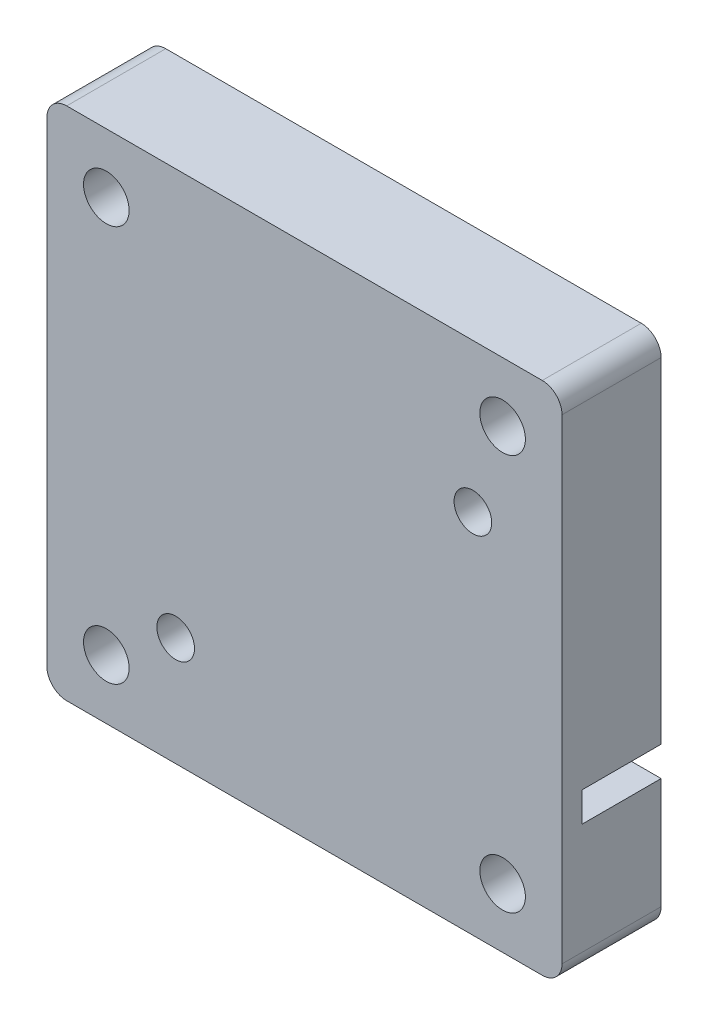
ISO-10303-21;
HEADER;
FILE_DESCRIPTION(('STEP AP214'),'2;1');
FILE_NAME('part.step','',(''),(''),'','','');
FILE_SCHEMA(('AUTOMOTIVE_DESIGN { 1 0 10303 214 1 1 1 1 }'));
ENDSEC;
DATA;
#1=APPLICATION_CONTEXT('core data for automotive mechanical design processes');
#2=APPLICATION_PROTOCOL_DEFINITION('international standard','automotive_design',2000,#1);
#3=PRODUCT_CONTEXT('',#1,'mechanical');
#4=PRODUCT('Part','Part','',(#3));
#5=PRODUCT_RELATED_PRODUCT_CATEGORY('part','',(#4));
#6=PRODUCT_DEFINITION_FORMATION('','',#4);
#7=PRODUCT_DEFINITION_CONTEXT('part definition',#1,'design');
#8=PRODUCT_DEFINITION('design','',#6,#7);
#9=PRODUCT_DEFINITION_SHAPE('','',#8);
#10=(LENGTH_UNIT() NAMED_UNIT(*) SI_UNIT(.MILLI.,.METRE.));
#11=(NAMED_UNIT(*) PLANE_ANGLE_UNIT() SI_UNIT($,.RADIAN.));
#12=(NAMED_UNIT(*) SI_UNIT($,.STERADIAN.) SOLID_ANGLE_UNIT());
#13=UNCERTAINTY_MEASURE_WITH_UNIT(LENGTH_MEASURE(1.E-05),#10,'distance_accuracy_value','');
#14=(GEOMETRIC_REPRESENTATION_CONTEXT(3) GLOBAL_UNCERTAINTY_ASSIGNED_CONTEXT((#13)) GLOBAL_UNIT_ASSIGNED_CONTEXT((#10,
#11,#12)) REPRESENTATION_CONTEXT('',''));
#15=CARTESIAN_POINT('',(0.,0.,0.));
#16=DIRECTION('',(0.,0.,1.));
#17=DIRECTION('',(1.,0.,0.));
#18=AXIS2_PLACEMENT_3D('',#15,#16,#17);
#19=CARTESIAN_POINT('',(6.6,-1.6,4.));
#20=DIRECTION('',(-1.,0.,0.));
#21=DIRECTION('',(0.,0.,1.));
#22=AXIS2_PLACEMENT_3D('',#19,#20,#21);
#23=PLANE('',#22);
#24=DIRECTION('',(0.,1.,0.));
#25=VECTOR('',#24,1.);
#26=CARTESIAN_POINT('',(6.6,-1.6,0.));
#27=LINE('',#26,#25);
#28=CARTESIAN_POINT('',(6.6,-2.4,0.));
#29=VERTEX_POINT('',#28);
#30=CARTESIAN_POINT('',(6.6,-1.6,0.));
#31=VERTEX_POINT('',#30);
#32=EDGE_CURVE('E268',#29,#31,#27,.T.);
#33=ORIENTED_EDGE('',*,*,#32,.F.);
#34=DIRECTION('',(0.,0.,1.));
#35=VECTOR('',#34,1.);
#36=CARTESIAN_POINT('',(6.6,-2.4,4.));
#37=LINE('',#36,#35);
#38=CARTESIAN_POINT('',(6.6,-2.4,4.));
#39=VERTEX_POINT('',#38);
#40=EDGE_CURVE('E316',#29,#39,#37,.T.);
#41=ORIENTED_EDGE('',*,*,#40,.T.);
#42=DIRECTION('',(0.,1.,0.));
#43=VECTOR('',#42,1.);
#44=CARTESIAN_POINT('',(6.6,-1.6,4.));
#45=LINE('',#44,#43);
#46=CARTESIAN_POINT('',(6.6,-1.6,4.));
#47=VERTEX_POINT('',#46);
#48=EDGE_CURVE('E255',#39,#47,#45,.T.);
#49=ORIENTED_EDGE('',*,*,#48,.T.);
#50=DIRECTION('',(0.,0.,-1.));
#51=VECTOR('',#50,1.);
#52=CARTESIAN_POINT('',(6.6,-1.6,4.));
#53=LINE('',#52,#51);
#54=EDGE_CURVE('E276',#47,#31,#53,.T.);
#55=ORIENTED_EDGE('',*,*,#54,.T.);
#56=EDGE_LOOP('',(#33,#41,#49,#55));
#57=FACE_BOUND('',#56,.T.);
#58=ADVANCED_FACE('F33',(#57),#23,.T.);
#59=CARTESIAN_POINT('',(-11.,11.,4.));
#60=DIRECTION('',(0.,0.,-1.));
#61=DIRECTION('',(-1.,0.,0.));
#62=AXIS2_PLACEMENT_3D('',#59,#60,#61);
#63=CYLINDRICAL_SURFACE('',#62,1.15);
#64=CARTESIAN_POINT('',(-11.,11.,5.));
#65=DIRECTION('',(0.,0.,1.));
#66=DIRECTION('',(1.,0.,0.));
#67=AXIS2_PLACEMENT_3D('',#64,#65,#66);
#68=CIRCLE('',#67,1.15);
#69=CARTESIAN_POINT('',(-9.85,11.,5.));
#70=VERTEX_POINT('',#69);
#71=EDGE_CURVE('E219',#70,#70,#68,.T.);
#72=ORIENTED_EDGE('',*,*,#71,.T.);
#73=EDGE_LOOP('',(#72));
#74=FACE_BOUND('',#73,.T.);
#75=CARTESIAN_POINT('',(-11.,11.,2.2));
#76=DIRECTION('',(0.,0.,-1.));
#77=DIRECTION('',(-1.,0.,0.));
#78=AXIS2_PLACEMENT_3D('',#75,#76,#77);
#79=CIRCLE('',#78,1.15);
#80=CARTESIAN_POINT('',(-12.15,11.,2.2));
#81=VERTEX_POINT('',#80);
#82=EDGE_CURVE('E218',#81,#81,#79,.T.);
#83=ORIENTED_EDGE('',*,*,#82,.T.);
#84=EDGE_LOOP('',(#83));
#85=FACE_BOUND('',#84,.T.);
#86=ADVANCED_FACE('F427',(#74,#85),#63,.F.);
#87=CARTESIAN_POINT('',(9.,-9.,4.));
#88=DIRECTION('',(0.,0.,-1.));
#89=DIRECTION('',(-1.,0.,0.));
#90=AXIS2_PLACEMENT_3D('',#87,#88,#89);
#91=CYLINDRICAL_SURFACE('',#90,1.15);
#92=CARTESIAN_POINT('',(9.,-9.,5.));
#93=DIRECTION('',(0.,0.,1.));
#94=DIRECTION('',(1.,0.,0.));
#95=AXIS2_PLACEMENT_3D('',#92,#93,#94);
#96=CIRCLE('',#95,1.15);
#97=CARTESIAN_POINT('',(10.15,-9.,5.));
#98=VERTEX_POINT('',#97);
#99=EDGE_CURVE('E225',#98,#98,#96,.T.);
#100=ORIENTED_EDGE('',*,*,#99,.T.);
#101=EDGE_LOOP('',(#100));
#102=FACE_BOUND('',#101,.T.);
#103=CARTESIAN_POINT('',(9.,-9.,2.2));
#104=DIRECTION('',(0.,0.,-1.));
#105=DIRECTION('',(-1.,0.,0.));
#106=AXIS2_PLACEMENT_3D('',#103,#104,#105);
#107=CIRCLE('',#106,1.15);
#108=CARTESIAN_POINT('',(7.85,-9.,2.2));
#109=VERTEX_POINT('',#108);
#110=EDGE_CURVE('E306',#109,#109,#107,.T.);
#111=ORIENTED_EDGE('',*,*,#110,.T.);
#112=EDGE_LOOP('',(#111));
#113=FACE_BOUND('',#112,.T.);
#114=ADVANCED_FACE('F432',(#102,#113),#91,.F.);
#115=CARTESIAN_POINT('',(-11.,-9.,4.));
#116=DIRECTION('',(0.,0.,-1.));
#117=DIRECTION('',(-1.,0.,0.));
#118=AXIS2_PLACEMENT_3D('',#115,#116,#117);
#119=CYLINDRICAL_SURFACE('',#118,1.15);
#120=CARTESIAN_POINT('',(-11.,-9.,5.));
#121=DIRECTION('',(0.,0.,1.));
#122=DIRECTION('',(1.,0.,0.));
#123=AXIS2_PLACEMENT_3D('',#120,#121,#122);
#124=CIRCLE('',#123,1.15);
#125=CARTESIAN_POINT('',(-9.85,-9.,5.));
#126=VERTEX_POINT('',#125);
#127=EDGE_CURVE('E228',#126,#126,#124,.T.);
#128=ORIENTED_EDGE('',*,*,#127,.T.);
#129=EDGE_LOOP('',(#128));
#130=FACE_BOUND('',#129,.T.);
#131=CARTESIAN_POINT('',(-11.,-9.,2.2));
#132=DIRECTION('',(0.,0.,-1.));
#133=DIRECTION('',(-1.,0.,0.));
#134=AXIS2_PLACEMENT_3D('',#131,#132,#133);
#135=CIRCLE('',#134,1.15);
#136=CARTESIAN_POINT('',(-12.15,-9.,2.2));
#137=VERTEX_POINT('',#136);
#138=EDGE_CURVE('E195',#137,#137,#135,.T.);
#139=ORIENTED_EDGE('',*,*,#138,.T.);
#140=EDGE_LOOP('',(#139));
#141=FACE_BOUND('',#140,.T.);
#142=ADVANCED_FACE('F455',(#130,#141),#119,.F.);
#143=CARTESIAN_POINT('',(9.,11.,4.));
#144=DIRECTION('',(0.,0.,-1.));
#145=DIRECTION('',(-1.,0.,0.));
#146=AXIS2_PLACEMENT_3D('',#143,#144,#145);
#147=CYLINDRICAL_SURFACE('',#146,1.15);
#148=CARTESIAN_POINT('',(9.,11.,5.));
#149=DIRECTION('',(0.,0.,1.));
#150=DIRECTION('',(1.,0.,0.));
#151=AXIS2_PLACEMENT_3D('',#148,#149,#150);
#152=CIRCLE('',#151,1.15);
#153=CARTESIAN_POINT('',(10.15,11.,5.));
#154=VERTEX_POINT('',#153);
#155=EDGE_CURVE('E222',#154,#154,#152,.T.);
#156=ORIENTED_EDGE('',*,*,#155,.T.);
#157=EDGE_LOOP('',(#156));
#158=FACE_BOUND('',#157,.T.);
#159=CARTESIAN_POINT('',(9.,11.,2.2));
#160=DIRECTION('',(0.,0.,-1.));
#161=DIRECTION('',(-1.,0.,0.));
#162=AXIS2_PLACEMENT_3D('',#159,#160,#161);
#163=CIRCLE('',#162,1.15);
#164=CARTESIAN_POINT('',(7.85,11.,2.2));
#165=VERTEX_POINT('',#164);
#166=EDGE_CURVE('E214',#165,#165,#163,.T.);
#167=ORIENTED_EDGE('',*,*,#166,.T.);
#168=EDGE_LOOP('',(#167));
#169=FACE_BOUND('',#168,.T.);
#170=ADVANCED_FACE('F458',(#158,#169),#147,.F.);
#171=CARTESIAN_POINT('',(0.,0.,0.));
#172=DIRECTION('',(0.,0.,-1.));
#173=DIRECTION('',(-1.,0.,0.));
#174=AXIS2_PLACEMENT_3D('',#171,#172,#173);
#175=PLANE('',#174);
#176=DIRECTION('',(1.,0.,0.));
#177=VECTOR('',#176,1.);
#178=CARTESIAN_POINT('',(-14.,-12.,0.));
#179=LINE('',#178,#177);
#180=CARTESIAN_POINT('',(-13.,-12.,0.));
#181=VERTEX_POINT('',#180);
#182=CARTESIAN_POINT('',(11.,-12.,0.));
#183=VERTEX_POINT('',#182);
#184=EDGE_CURVE('E298',#181,#183,#179,.T.);
#185=ORIENTED_EDGE('',*,*,#184,.F.);
#186=CARTESIAN_POINT('',(-13.,-11.,0.));
#187=DIRECTION('',(0.,0.,-1.));
#188=DIRECTION('',(-1.,0.,0.));
#189=AXIS2_PLACEMENT_3D('',#186,#187,#188);
#190=CIRCLE('',#189,1.);
#191=CARTESIAN_POINT('',(-14.,-11.,0.));
#192=VERTEX_POINT('',#191);
#193=EDGE_CURVE('E337',#181,#192,#190,.T.);
#194=ORIENTED_EDGE('',*,*,#193,.T.);
#195=DIRECTION('',(0.,-1.,0.));
#196=VECTOR('',#195,1.);
#197=CARTESIAN_POINT('',(-14.,-12.,0.));
#198=LINE('',#197,#196);
#199=CARTESIAN_POINT('',(-14.,13.,0.));
#200=VERTEX_POINT('',#199);
#201=EDGE_CURVE('E295',#200,#192,#198,.T.);
#202=ORIENTED_EDGE('',*,*,#201,.F.);
#203=CARTESIAN_POINT('',(-13.,13.,0.));
#204=DIRECTION('',(0.,0.,-1.));
#205=DIRECTION('',(-1.,0.,0.));
#206=AXIS2_PLACEMENT_3D('',#203,#204,#205);
#207=CIRCLE('',#206,1.);
#208=CARTESIAN_POINT('',(-13.,14.,0.));
#209=VERTEX_POINT('',#208);
#210=EDGE_CURVE('E331',#200,#209,#207,.T.);
#211=ORIENTED_EDGE('',*,*,#210,.T.);
#212=DIRECTION('',(-1.,0.,0.));
#213=VECTOR('',#212,1.);
#214=CARTESIAN_POINT('',(-14.,14.,0.));
#215=LINE('',#214,#213);
#216=CARTESIAN_POINT('',(11.,14.,0.));
#217=VERTEX_POINT('',#216);
#218=EDGE_CURVE('E293',#217,#209,#215,.T.);
#219=ORIENTED_EDGE('',*,*,#218,.F.);
#220=CARTESIAN_POINT('',(11.,13.,0.));
#221=DIRECTION('',(0.,0.,-1.));
#222=DIRECTION('',(-1.,0.,0.));
#223=AXIS2_PLACEMENT_3D('',#220,#221,#222);
#224=CIRCLE('',#223,1.);
#225=CARTESIAN_POINT('',(12.,13.,0.));
#226=VERTEX_POINT('',#225);
#227=EDGE_CURVE('E333',#217,#226,#224,.T.);
#228=ORIENTED_EDGE('',*,*,#227,.T.);
#229=DIRECTION('',(0.,1.,0.));
#230=VECTOR('',#229,1.);
#231=CARTESIAN_POINT('',(12.,-12.,0.));
#232=LINE('',#231,#230);
#233=CARTESIAN_POINT('',(12.,-3.9,0.));
#234=VERTEX_POINT('',#233);
#235=EDGE_CURVE('E290',#234,#226,#232,.T.);
#236=ORIENTED_EDGE('',*,*,#235,.F.);
#237=DIRECTION('',(1.,0.,0.));
#238=VECTOR('',#237,1.);
#239=CARTESIAN_POINT('',(12.,-3.9,0.));
#240=LINE('',#239,#238);
#241=CARTESIAN_POINT('',(8.09999999999999,-3.9,0.));
#242=VERTEX_POINT('',#241);
#243=EDGE_CURVE('E178',#242,#234,#240,.T.);
#244=ORIENTED_EDGE('',*,*,#243,.F.);
#245=DIRECTION('',(-0.707106781186546,0.707106781186549,0.));
#246=VECTOR('',#245,1.);
#247=CARTESIAN_POINT('',(2.10000000000001,2.1,0.));
#248=LINE('',#247,#246);
#249=EDGE_CURVE('E314',#242,#29,#248,.T.);
#250=ORIENTED_EDGE('',*,*,#249,.T.);
#251=ORIENTED_EDGE('',*,*,#32,.T.);
#252=DIRECTION('',(-1.,0.,0.));
#253=VECTOR('',#252,1.);
#254=CARTESIAN_POINT('',(-5.5,-1.6,0.));
#255=LINE('',#254,#253);
#256=CARTESIAN_POINT('',(-5.5,-1.6,0.));
#257=VERTEX_POINT('',#256);
#258=EDGE_CURVE('E252',#31,#257,#255,.T.);
#259=ORIENTED_EDGE('',*,*,#258,.T.);
#260=DIRECTION('',(0.,-1.,0.));
#261=VECTOR('',#260,1.);
#262=CARTESIAN_POINT('',(-5.5,-1.6,0.));
#263=LINE('',#262,#261);
#264=CARTESIAN_POINT('',(-5.5,-7.69999999999999,0.));
#265=VERTEX_POINT('',#264);
#266=EDGE_CURVE('E247',#257,#265,#263,.T.);
#267=ORIENTED_EDGE('',*,*,#266,.T.);
#268=DIRECTION('',(1.,0.,0.));
#269=VECTOR('',#268,1.);
#270=CARTESIAN_POINT('',(-5.5,-7.69999999999999,0.));
#271=LINE('',#270,#269);
#272=CARTESIAN_POINT('',(6.6,-7.69999999999999,0.));
#273=VERTEX_POINT('',#272);
#274=EDGE_CURVE('E265',#265,#273,#271,.T.);
#275=ORIENTED_EDGE('',*,*,#274,.T.);
#276=CARTESIAN_POINT('',(6.6,-6.89999999999999,0.));
#277=VERTEX_POINT('',#276);
#278=EDGE_CURVE('E269',#273,#277,#27,.T.);
#279=ORIENTED_EDGE('',*,*,#278,.T.);
#280=DIRECTION('',(0.707106781186549,0.707106781186546,0.));
#281=VECTOR('',#280,1.);
#282=CARTESIAN_POINT('',(6.74999999999998,-6.75000000000001,0.));
#283=LINE('',#282,#281);
#284=CARTESIAN_POINT('',(8.1,-5.4,0.));
#285=VERTEX_POINT('',#284);
#286=EDGE_CURVE('E312',#277,#285,#283,.T.);
#287=ORIENTED_EDGE('',*,*,#286,.T.);
#288=DIRECTION('',(-1.,0.,0.));
#289=VECTOR('',#288,1.);
#290=CARTESIAN_POINT('',(12.,-5.4,0.));
#291=LINE('',#290,#289);
#292=CARTESIAN_POINT('',(12.,-5.4,0.));
#293=VERTEX_POINT('',#292);
#294=EDGE_CURVE('E173',#293,#285,#291,.T.);
#295=ORIENTED_EDGE('',*,*,#294,.F.);
#296=CARTESIAN_POINT('',(12.,-11.,0.));
#297=VERTEX_POINT('',#296);
#298=EDGE_CURVE('E291',#297,#293,#232,.T.);
#299=ORIENTED_EDGE('',*,*,#298,.F.);
#300=CARTESIAN_POINT('',(11.,-11.,0.));
#301=DIRECTION('',(0.,0.,-1.));
#302=DIRECTION('',(-1.,0.,0.));
#303=AXIS2_PLACEMENT_3D('',#300,#301,#302);
#304=CIRCLE('',#303,1.);
#305=EDGE_CURVE('E335',#297,#183,#304,.T.);
#306=ORIENTED_EDGE('',*,*,#305,.T.);
#307=EDGE_LOOP('',(#185,#194,#202,#211,#219,#228,#236,#244,#250,#251,#259,#267,#275,#279,#287,
#295,#299,#306));
#308=FACE_BOUND('',#307,.T.);
#309=CARTESIAN_POINT('',(-11.,11.,0.));
#310=DIRECTION('',(0.,0.,-1.));
#311=DIRECTION('',(-1.,0.,0.));
#312=AXIS2_PLACEMENT_3D('',#309,#310,#311);
#313=CIRCLE('',#312,2.1);
#314=CARTESIAN_POINT('',(-13.1,11.,0.));
#315=VERTEX_POINT('',#314);
#316=EDGE_CURVE('E196',#315,#315,#313,.T.);
#317=ORIENTED_EDGE('',*,*,#316,.F.);
#318=EDGE_LOOP('',(#317));
#319=FACE_BOUND('',#318,.T.);
#320=CARTESIAN_POINT('',(-11.,-9.,0.));
#321=DIRECTION('',(0.,0.,-1.));
#322=DIRECTION('',(-1.,0.,0.));
#323=AXIS2_PLACEMENT_3D('',#320,#321,#322);
#324=CIRCLE('',#323,2.1);
#325=CARTESIAN_POINT('',(-13.1,-9.,0.));
#326=VERTEX_POINT('',#325);
#327=EDGE_CURVE('E202',#326,#326,#324,.T.);
#328=ORIENTED_EDGE('',*,*,#327,.F.);
#329=EDGE_LOOP('',(#328));
#330=FACE_BOUND('',#329,.T.);
#331=CARTESIAN_POINT('',(9.,-9.,0.));
#332=DIRECTION('',(0.,0.,-1.));
#333=DIRECTION('',(-1.,0.,0.));
#334=AXIS2_PLACEMENT_3D('',#331,#332,#333);
#335=CIRCLE('',#334,2.1);
#336=CARTESIAN_POINT('',(6.9,-9.,0.));
#337=VERTEX_POINT('',#336);
#338=EDGE_CURVE('E208',#337,#337,#335,.T.);
#339=ORIENTED_EDGE('',*,*,#338,.F.);
#340=EDGE_LOOP('',(#339));
#341=FACE_BOUND('',#340,.T.);
#342=CARTESIAN_POINT('',(9.,11.,0.));
#343=DIRECTION('',(0.,0.,-1.));
#344=DIRECTION('',(-1.,0.,0.));
#345=AXIS2_PLACEMENT_3D('',#342,#343,#344);
#346=CIRCLE('',#345,2.1);
#347=CARTESIAN_POINT('',(6.9,11.,0.));
#348=VERTEX_POINT('',#347);
#349=EDGE_CURVE('E215',#348,#348,#346,.T.);
#350=ORIENTED_EDGE('',*,*,#349,.F.);
#351=EDGE_LOOP('',(#350));
#352=FACE_BOUND('',#351,.T.);
#353=CARTESIAN_POINT('',(7.5,6.5,0.));
#354=DIRECTION('',(0.,0.,1.));
#355=DIRECTION('',(1.,0.,0.));
#356=AXIS2_PLACEMENT_3D('',#353,#354,#355);
#357=CIRCLE('',#356,0.949999999999999);
#358=CARTESIAN_POINT('',(8.45,6.5,0.));
#359=VERTEX_POINT('',#358);
#360=EDGE_CURVE('E287',#359,#359,#357,.T.);
#361=ORIENTED_EDGE('',*,*,#360,.T.);
#362=EDGE_LOOP('',(#361));
#363=FACE_BOUND('',#362,.T.);
#364=CARTESIAN_POINT('',(-7.5,-6.5,0.));
#365=DIRECTION('',(0.,0.,1.));
#366=DIRECTION('',(1.,0.,0.));
#367=AXIS2_PLACEMENT_3D('',#364,#365,#366);
#368=CIRCLE('',#367,0.95);
#369=CARTESIAN_POINT('',(-6.55,-6.5,0.));
#370=VERTEX_POINT('',#369);
#371=EDGE_CURVE('E284',#370,#370,#368,.T.);
#372=ORIENTED_EDGE('',*,*,#371,.T.);
#373=EDGE_LOOP('',(#372));
#374=FACE_BOUND('',#373,.T.);
#375=ADVANCED_FACE('F362',(#308,#319,#330,#341,#352,#363,#374),#175,.T.);
#376=CARTESIAN_POINT('',(12.,-12.,4.));
#377=DIRECTION('',(-1.,0.,0.));
#378=DIRECTION('',(0.,0.,1.));
#379=AXIS2_PLACEMENT_3D('',#376,#377,#378);
#380=PLANE('',#379);
#381=DIRECTION('',(0.,1.,0.));
#382=VECTOR('',#381,1.);
#383=CARTESIAN_POINT('',(12.,-12.,5.));
#384=LINE('',#383,#382);
#385=CARTESIAN_POINT('',(12.,-11.,5.));
#386=VERTEX_POINT('',#385);
#387=CARTESIAN_POINT('',(12.,13.,5.));
#388=VERTEX_POINT('',#387);
#389=EDGE_CURVE('E240',#386,#388,#384,.T.);
#390=ORIENTED_EDGE('',*,*,#389,.F.);
#391=DIRECTION('',(0.,0.,-1.));
#392=VECTOR('',#391,1.);
#393=CARTESIAN_POINT('',(12.,-11.,4.));
#394=LINE('',#393,#392);
#395=EDGE_CURVE('E353',#386,#297,#394,.T.);
#396=ORIENTED_EDGE('',*,*,#395,.T.);
#397=ORIENTED_EDGE('',*,*,#298,.T.);
#398=DIRECTION('',(0.,0.,-1.));
#399=VECTOR('',#398,1.);
#400=CARTESIAN_POINT('',(12.,-5.4,9.60446250768083));
#401=LINE('',#400,#399);
#402=CARTESIAN_POINT('',(12.,-5.4,4.));
#403=VERTEX_POINT('',#402);
#404=EDGE_CURVE('E186',#403,#293,#401,.T.);
#405=ORIENTED_EDGE('',*,*,#404,.F.);
#406=DIRECTION('',(0.,-1.,0.));
#407=VECTOR('',#406,1.);
#408=CARTESIAN_POINT('',(12.,-5.4,4.));
#409=LINE('',#408,#407);
#410=CARTESIAN_POINT('',(12.,-3.9,4.));
#411=VERTEX_POINT('',#410);
#412=EDGE_CURVE('E164',#411,#403,#409,.T.);
#413=ORIENTED_EDGE('',*,*,#412,.F.);
#414=DIRECTION('',(0.,0.,-1.));
#415=VECTOR('',#414,1.);
#416=CARTESIAN_POINT('',(12.,-3.9,9.60446250768083));
#417=LINE('',#416,#415);
#418=EDGE_CURVE('E172',#411,#234,#417,.T.);
#419=ORIENTED_EDGE('',*,*,#418,.T.);
#420=ORIENTED_EDGE('',*,*,#235,.T.);
#421=DIRECTION('',(0.,0.,-1.));
#422=VECTOR('',#421,1.);
#423=CARTESIAN_POINT('',(12.,13.,4.));
#424=LINE('',#423,#422);
#425=EDGE_CURVE('E351',#226,#388,#424,.F.);
#426=ORIENTED_EDGE('',*,*,#425,.T.);
#427=EDGE_LOOP('',(#390,#396,#397,#405,#413,#419,#420,#426));
#428=FACE_BOUND('',#427,.T.);
#429=ADVANCED_FACE('F184',(#428),#380,.F.);
#430=CARTESIAN_POINT('',(-14.,14.,4.));
#431=DIRECTION('',(0.,-1.,0.));
#432=DIRECTION('',(0.,0.,-1.));
#433=AXIS2_PLACEMENT_3D('',#430,#431,#432);
#434=PLANE('',#433);
#435=DIRECTION('',(-1.,0.,0.));
#436=VECTOR('',#435,1.);
#437=CARTESIAN_POINT('',(12.,14.,5.));
#438=LINE('',#437,#436);
#439=CARTESIAN_POINT('',(11.,14.,5.));
#440=VERTEX_POINT('',#439);
#441=CARTESIAN_POINT('',(-13.,14.,5.));
#442=VERTEX_POINT('',#441);
#443=EDGE_CURVE('E242',#440,#442,#438,.T.);
#444=ORIENTED_EDGE('',*,*,#443,.F.);
#445=DIRECTION('',(0.,0.,-1.));
#446=VECTOR('',#445,1.);
#447=CARTESIAN_POINT('',(11.,14.,4.));
#448=LINE('',#447,#446);
#449=EDGE_CURVE('E11',#440,#217,#448,.T.);
#450=ORIENTED_EDGE('',*,*,#449,.T.);
#451=ORIENTED_EDGE('',*,*,#218,.T.);
#452=DIRECTION('',(0.,0.,-1.));
#453=VECTOR('',#452,1.);
#454=CARTESIAN_POINT('',(-13.,14.,4.));
#455=LINE('',#454,#453);
#456=EDGE_CURVE('E41',#209,#442,#455,.F.);
#457=ORIENTED_EDGE('',*,*,#456,.T.);
#458=EDGE_LOOP('',(#444,#450,#451,#457));
#459=FACE_BOUND('',#458,.T.);
#460=ADVANCED_FACE('F399',(#459),#434,.F.);
#461=CARTESIAN_POINT('',(-14.,-12.,4.));
#462=DIRECTION('',(1.,0.,0.));
#463=DIRECTION('',(0.,0.,-1.));
#464=AXIS2_PLACEMENT_3D('',#461,#462,#463);
#465=PLANE('',#464);
#466=ORIENTED_EDGE('',*,*,#201,.T.);
#467=DIRECTION('',(0.,0.,-1.));
#468=VECTOR('',#467,1.);
#469=CARTESIAN_POINT('',(-14.,-11.,4.));
#470=LINE('',#469,#468);
#471=CARTESIAN_POINT('',(-14.,-11.,5.));
#472=VERTEX_POINT('',#471);
#473=EDGE_CURVE('E342',#192,#472,#470,.F.);
#474=ORIENTED_EDGE('',*,*,#473,.T.);
#475=DIRECTION('',(0.,-1.,0.));
#476=VECTOR('',#475,1.);
#477=CARTESIAN_POINT('',(-14.,14.,5.));
#478=LINE('',#477,#476);
#479=CARTESIAN_POINT('',(-14.,13.,5.));
#480=VERTEX_POINT('',#479);
#481=EDGE_CURVE('E244',#480,#472,#478,.T.);
#482=ORIENTED_EDGE('',*,*,#481,.F.);
#483=DIRECTION('',(0.,0.,-1.));
#484=VECTOR('',#483,1.);
#485=CARTESIAN_POINT('',(-14.,13.,4.));
#486=LINE('',#485,#484);
#487=EDGE_CURVE('E339',#480,#200,#486,.T.);
#488=ORIENTED_EDGE('',*,*,#487,.T.);
#489=EDGE_LOOP('',(#466,#474,#482,#488));
#490=FACE_BOUND('',#489,.T.);
#491=ADVANCED_FACE('F406',(#490),#465,.F.);
#492=CARTESIAN_POINT('',(-14.,-12.,4.));
#493=DIRECTION('',(0.,1.,0.));
#494=DIRECTION('',(0.,0.,1.));
#495=AXIS2_PLACEMENT_3D('',#492,#493,#494);
#496=PLANE('',#495);
#497=DIRECTION('',(1.,0.,0.));
#498=VECTOR('',#497,1.);
#499=CARTESIAN_POINT('',(-14.,-12.,5.));
#500=LINE('',#499,#498);
#501=CARTESIAN_POINT('',(-13.,-12.,5.));
#502=VERTEX_POINT('',#501);
#503=CARTESIAN_POINT('',(11.,-12.,5.));
#504=VERTEX_POINT('',#503);
#505=EDGE_CURVE('E237',#502,#504,#500,.T.);
#506=ORIENTED_EDGE('',*,*,#505,.F.);
#507=DIRECTION('',(0.,0.,-1.));
#508=VECTOR('',#507,1.);
#509=CARTESIAN_POINT('',(-13.,-12.,4.));
#510=LINE('',#509,#508);
#511=EDGE_CURVE('E328',#502,#181,#510,.T.);
#512=ORIENTED_EDGE('',*,*,#511,.T.);
#513=ORIENTED_EDGE('',*,*,#184,.T.);
#514=DIRECTION('',(0.,0.,-1.));
#515=VECTOR('',#514,1.);
#516=CARTESIAN_POINT('',(11.,-12.,4.));
#517=LINE('',#516,#515);
#518=EDGE_CURVE('E326',#183,#504,#517,.F.);
#519=ORIENTED_EDGE('',*,*,#518,.T.);
#520=EDGE_LOOP('',(#506,#512,#513,#519));
#521=FACE_BOUND('',#520,.T.);
#522=ADVANCED_FACE('F416',(#521),#496,.F.);
#523=CARTESIAN_POINT('',(7.5,6.5,4.));
#524=DIRECTION('',(0.,0.,-1.));
#525=DIRECTION('',(-1.,0.,0.));
#526=AXIS2_PLACEMENT_3D('',#523,#524,#525);
#527=CYLINDRICAL_SURFACE('',#526,0.949999999999999);
#528=ORIENTED_EDGE('',*,*,#360,.F.);
#529=EDGE_LOOP('',(#528));
#530=FACE_BOUND('',#529,.T.);
#531=CARTESIAN_POINT('',(7.5,6.5,5.));
#532=DIRECTION('',(0.,0.,1.));
#533=DIRECTION('',(1.,0.,0.));
#534=AXIS2_PLACEMENT_3D('',#531,#532,#533);
#535=CIRCLE('',#534,0.949999999999999);
#536=CARTESIAN_POINT('',(8.45,6.5,5.));
#537=VERTEX_POINT('',#536);
#538=EDGE_CURVE('E234',#537,#537,#535,.T.);
#539=ORIENTED_EDGE('',*,*,#538,.T.);
#540=EDGE_LOOP('',(#539));
#541=FACE_BOUND('',#540,.T.);
#542=ADVANCED_FACE('F450',(#530,#541),#527,.F.);
#543=CARTESIAN_POINT('',(-7.5,-6.5,4.));
#544=DIRECTION('',(0.,0.,-1.));
#545=DIRECTION('',(-1.,0.,0.));
#546=AXIS2_PLACEMENT_3D('',#543,#544,#545);
#547=CYLINDRICAL_SURFACE('',#546,0.95);
#548=ORIENTED_EDGE('',*,*,#371,.F.);
#549=EDGE_LOOP('',(#548));
#550=FACE_BOUND('',#549,.T.);
#551=CARTESIAN_POINT('',(-7.5,-6.5,5.));
#552=DIRECTION('',(0.,0.,1.));
#553=DIRECTION('',(1.,0.,0.));
#554=AXIS2_PLACEMENT_3D('',#551,#552,#553);
#555=CIRCLE('',#554,0.95);
#556=CARTESIAN_POINT('',(-6.55,-6.5,5.));
#557=VERTEX_POINT('',#556);
#558=EDGE_CURVE('E231',#557,#557,#555,.T.);
#559=ORIENTED_EDGE('',*,*,#558,.T.);
#560=EDGE_LOOP('',(#559));
#561=FACE_BOUND('',#560,.T.);
#562=ADVANCED_FACE('F445',(#550,#561),#547,.F.);
#563=CARTESIAN_POINT('',(-5.5,-1.6,4.));
#564=DIRECTION('',(1.,0.,0.));
#565=DIRECTION('',(0.,0.,-1.));
#566=AXIS2_PLACEMENT_3D('',#563,#564,#565);
#567=PLANE('',#566);
#568=ORIENTED_EDGE('',*,*,#266,.F.);
#569=DIRECTION('',(0.,0.,-1.));
#570=VECTOR('',#569,1.);
#571=CARTESIAN_POINT('',(-5.5,-1.6,4.));
#572=LINE('',#571,#570);
#573=CARTESIAN_POINT('',(-5.5,-1.6,4.));
#574=VERTEX_POINT('',#573);
#575=EDGE_CURVE('E262',#574,#257,#572,.T.);
#576=ORIENTED_EDGE('',*,*,#575,.F.);
#577=DIRECTION('',(0.,-1.,0.));
#578=VECTOR('',#577,1.);
#579=CARTESIAN_POINT('',(-5.5,-1.6,4.));
#580=LINE('',#579,#578);
#581=CARTESIAN_POINT('',(-5.5,-7.69999999999999,4.));
#582=VERTEX_POINT('',#581);
#583=EDGE_CURVE('E248',#574,#582,#580,.T.);
#584=ORIENTED_EDGE('',*,*,#583,.T.);
#585=DIRECTION('',(0.,0.,-1.));
#586=VECTOR('',#585,1.);
#587=CARTESIAN_POINT('',(-5.5,-7.69999999999999,4.));
#588=LINE('',#587,#586);
#589=EDGE_CURVE('E281',#582,#265,#588,.T.);
#590=ORIENTED_EDGE('',*,*,#589,.T.);
#591=EDGE_LOOP('',(#568,#576,#584,#590));
#592=FACE_BOUND('',#591,.T.);
#593=ADVANCED_FACE('F384',(#592),#567,.T.);
#594=CARTESIAN_POINT('',(-5.5,-7.69999999999999,4.));
#595=DIRECTION('',(0.,1.,0.));
#596=DIRECTION('',(0.,0.,1.));
#597=AXIS2_PLACEMENT_3D('',#594,#595,#596);
#598=PLANE('',#597);
#599=ORIENTED_EDGE('',*,*,#274,.F.);
#600=ORIENTED_EDGE('',*,*,#589,.F.);
#601=DIRECTION('',(1.,0.,0.));
#602=VECTOR('',#601,1.);
#603=CARTESIAN_POINT('',(-5.5,-7.69999999999999,4.));
#604=LINE('',#603,#602);
#605=CARTESIAN_POINT('',(6.6,-7.69999999999999,4.));
#606=VERTEX_POINT('',#605);
#607=EDGE_CURVE('E251',#582,#606,#604,.T.);
#608=ORIENTED_EDGE('',*,*,#607,.T.);
#609=DIRECTION('',(0.,0.,-1.));
#610=VECTOR('',#609,1.);
#611=CARTESIAN_POINT('',(6.6,-7.69999999999999,4.));
#612=LINE('',#611,#610);
#613=EDGE_CURVE('E279',#606,#273,#612,.T.);
#614=ORIENTED_EDGE('',*,*,#613,.T.);
#615=EDGE_LOOP('',(#599,#600,#608,#614));
#616=FACE_BOUND('',#615,.T.);
#617=ADVANCED_FACE('F379',(#616),#598,.T.);
#618=CARTESIAN_POINT('',(6.6,-6.89999999999999,4.));
#619=VERTEX_POINT('',#618);
#620=EDGE_CURVE('E256',#606,#619,#45,.T.);
#621=ORIENTED_EDGE('',*,*,#620,.T.);
#622=DIRECTION('',(0.,0.,-1.));
#623=VECTOR('',#622,1.);
#624=CARTESIAN_POINT('',(6.6,-6.89999999999999,0.));
#625=LINE('',#624,#623);
#626=EDGE_CURVE('E318',#619,#277,#625,.T.);
#627=ORIENTED_EDGE('',*,*,#626,.T.);
#628=ORIENTED_EDGE('',*,*,#278,.F.);
#629=ORIENTED_EDGE('',*,*,#613,.F.);
#630=EDGE_LOOP('',(#621,#627,#628,#629));
#631=FACE_BOUND('',#630,.T.);
#632=ADVANCED_FACE('F376',(#631),#23,.T.);
#633=CARTESIAN_POINT('',(-5.5,-1.6,4.));
#634=DIRECTION('',(0.,-1.,0.));
#635=DIRECTION('',(0.,0.,-1.));
#636=AXIS2_PLACEMENT_3D('',#633,#634,#635);
#637=PLANE('',#636);
#638=ORIENTED_EDGE('',*,*,#258,.F.);
#639=ORIENTED_EDGE('',*,*,#54,.F.);
#640=DIRECTION('',(-1.,0.,0.));
#641=VECTOR('',#640,1.);
#642=CARTESIAN_POINT('',(-5.5,-1.6,4.));
#643=LINE('',#642,#641);
#644=EDGE_CURVE('E259',#47,#574,#643,.T.);
#645=ORIENTED_EDGE('',*,*,#644,.T.);
#646=ORIENTED_EDGE('',*,*,#575,.T.);
#647=EDGE_LOOP('',(#638,#639,#645,#646));
#648=FACE_BOUND('',#647,.T.);
#649=ADVANCED_FACE('F387',(#648),#637,.T.);
#650=CARTESIAN_POINT('',(0.,0.,4.));
#651=DIRECTION('',(0.,0.,1.));
#652=DIRECTION('',(1.,0.,0.));
#653=AXIS2_PLACEMENT_3D('',#650,#651,#652);
#654=PLANE('',#653);
#655=ORIENTED_EDGE('',*,*,#583,.F.);
#656=ORIENTED_EDGE('',*,*,#644,.F.);
#657=ORIENTED_EDGE('',*,*,#48,.F.);
#658=DIRECTION('',(0.707106781186546,-0.707106781186549,0.));
#659=VECTOR('',#658,1.);
#660=CARTESIAN_POINT('',(2.10000000000001,2.1,4.));
#661=LINE('',#660,#659);
#662=CARTESIAN_POINT('',(8.09999999999999,-3.9,4.));
#663=VERTEX_POINT('',#662);
#664=EDGE_CURVE('E168',#39,#663,#661,.T.);
#665=ORIENTED_EDGE('',*,*,#664,.T.);
#666=DIRECTION('',(1.,0.,0.));
#667=VECTOR('',#666,1.);
#668=CARTESIAN_POINT('',(12.,-3.9,4.));
#669=LINE('',#668,#667);
#670=EDGE_CURVE('E159',#663,#411,#669,.T.);
#671=ORIENTED_EDGE('',*,*,#670,.T.);
#672=ORIENTED_EDGE('',*,*,#412,.T.);
#673=DIRECTION('',(-1.,0.,0.));
#674=VECTOR('',#673,1.);
#675=CARTESIAN_POINT('',(12.,-5.4,4.));
#676=LINE('',#675,#674);
#677=CARTESIAN_POINT('',(8.1,-5.4,4.));
#678=VERTEX_POINT('',#677);
#679=EDGE_CURVE('E188',#403,#678,#676,.T.);
#680=ORIENTED_EDGE('',*,*,#679,.T.);
#681=DIRECTION('',(-0.707106781186549,-0.707106781186546,0.));
#682=VECTOR('',#681,1.);
#683=CARTESIAN_POINT('',(6.74999999999998,-6.75000000000001,4.));
#684=LINE('',#683,#682);
#685=EDGE_CURVE('E324',#678,#619,#684,.T.);
#686=ORIENTED_EDGE('',*,*,#685,.T.);
#687=ORIENTED_EDGE('',*,*,#620,.F.);
#688=ORIENTED_EDGE('',*,*,#607,.F.);
#689=EDGE_LOOP('',(#655,#656,#657,#665,#671,#672,#680,#686,#687,#688));
#690=FACE_BOUND('',#689,.T.);
#691=ADVANCED_FACE('F161',(#690),#654,.F.);
#692=CARTESIAN_POINT('',(0.,0.,5.));
#693=DIRECTION('',(0.,0.,1.));
#694=DIRECTION('',(1.,0.,0.));
#695=AXIS2_PLACEMENT_3D('',#692,#693,#694);
#696=PLANE('',#695);
#697=ORIENTED_EDGE('',*,*,#155,.F.);
#698=EDGE_LOOP('',(#697));
#699=FACE_BOUND('',#698,.T.);
#700=ORIENTED_EDGE('',*,*,#127,.F.);
#701=EDGE_LOOP('',(#700));
#702=FACE_BOUND('',#701,.T.);
#703=ORIENTED_EDGE('',*,*,#538,.F.);
#704=EDGE_LOOP('',(#703));
#705=FACE_BOUND('',#704,.T.);
#706=ORIENTED_EDGE('',*,*,#481,.T.);
#707=CARTESIAN_POINT('',(-13.,-11.,5.));
#708=DIRECTION('',(0.,0.,1.));
#709=DIRECTION('',(1.,0.,0.));
#710=AXIS2_PLACEMENT_3D('',#707,#708,#709);
#711=CIRCLE('',#710,1.);
#712=EDGE_CURVE('E349',#472,#502,#711,.T.);
#713=ORIENTED_EDGE('',*,*,#712,.T.);
#714=ORIENTED_EDGE('',*,*,#505,.T.);
#715=CARTESIAN_POINT('',(11.,-11.,5.));
#716=DIRECTION('',(0.,0.,1.));
#717=DIRECTION('',(1.,0.,0.));
#718=AXIS2_PLACEMENT_3D('',#715,#716,#717);
#719=CIRCLE('',#718,1.);
#720=EDGE_CURVE('E347',#504,#386,#719,.T.);
#721=ORIENTED_EDGE('',*,*,#720,.T.);
#722=ORIENTED_EDGE('',*,*,#389,.T.);
#723=CARTESIAN_POINT('',(11.,13.,5.));
#724=DIRECTION('',(0.,0.,1.));
#725=DIRECTION('',(1.,0.,0.));
#726=AXIS2_PLACEMENT_3D('',#723,#724,#725);
#727=CIRCLE('',#726,1.);
#728=EDGE_CURVE('E54',#388,#440,#727,.T.);
#729=ORIENTED_EDGE('',*,*,#728,.T.);
#730=ORIENTED_EDGE('',*,*,#443,.T.);
#731=CARTESIAN_POINT('',(-13.,13.,5.));
#732=DIRECTION('',(0.,0.,1.));
#733=DIRECTION('',(1.,0.,0.));
#734=AXIS2_PLACEMENT_3D('',#731,#732,#733);
#735=CIRCLE('',#734,1.);
#736=EDGE_CURVE('E344',#442,#480,#735,.T.);
#737=ORIENTED_EDGE('',*,*,#736,.T.);
#738=EDGE_LOOP('',(#706,#713,#714,#721,#722,#729,#730,#737));
#739=FACE_BOUND('',#738,.T.);
#740=ORIENTED_EDGE('',*,*,#558,.F.);
#741=EDGE_LOOP('',(#740));
#742=FACE_BOUND('',#741,.T.);
#743=ORIENTED_EDGE('',*,*,#99,.F.);
#744=EDGE_LOOP('',(#743));
#745=FACE_BOUND('',#744,.T.);
#746=ORIENTED_EDGE('',*,*,#71,.F.);
#747=EDGE_LOOP('',(#746));
#748=FACE_BOUND('',#747,.T.);
#749=ADVANCED_FACE('F409',(#699,#702,#705,#739,#742,#745,#748),#696,.T.);
#750=CARTESIAN_POINT('',(9.,11.,2.2));
#751=DIRECTION('',(0.,0.,-1.));
#752=DIRECTION('',(-1.,0.,0.));
#753=AXIS2_PLACEMENT_3D('',#750,#751,#752);
#754=CYLINDRICAL_SURFACE('',#753,2.1);
#755=CARTESIAN_POINT('',(9.,11.,2.2));
#756=DIRECTION('',(0.,0.,-1.));
#757=DIRECTION('',(-1.,0.,0.));
#758=AXIS2_PLACEMENT_3D('',#755,#756,#757);
#759=CIRCLE('',#758,2.1);
#760=CARTESIAN_POINT('',(6.9,11.,2.2));
#761=VERTEX_POINT('',#760);
#762=EDGE_CURVE('E211',#761,#761,#759,.T.);
#763=ORIENTED_EDGE('',*,*,#762,.F.);
#764=EDGE_LOOP('',(#763));
#765=FACE_BOUND('',#764,.T.);
#766=ORIENTED_EDGE('',*,*,#349,.T.);
#767=EDGE_LOOP('',(#766));
#768=FACE_BOUND('',#767,.T.);
#769=ADVANCED_FACE('F515',(#765,#768),#754,.F.);
#770=CARTESIAN_POINT('',(9.,11.,2.2));
#771=DIRECTION('',(0.,0.,-1.));
#772=DIRECTION('',(-1.,0.,0.));
#773=AXIS2_PLACEMENT_3D('',#770,#771,#772);
#774=PLANE('',#773);
#775=ORIENTED_EDGE('',*,*,#166,.F.);
#776=EDGE_LOOP('',(#775));
#777=FACE_BOUND('',#776,.T.);
#778=ORIENTED_EDGE('',*,*,#762,.T.);
#779=EDGE_LOOP('',(#778));
#780=FACE_BOUND('',#779,.T.);
#781=ADVANCED_FACE('F698',(#777,#780),#774,.T.);
#782=CARTESIAN_POINT('',(-11.,-9.,2.2));
#783=DIRECTION('',(0.,0.,-1.));
#784=DIRECTION('',(-1.,0.,0.));
#785=AXIS2_PLACEMENT_3D('',#782,#783,#784);
#786=CYLINDRICAL_SURFACE('',#785,2.1);
#787=CARTESIAN_POINT('',(-11.,-9.,2.2));
#788=DIRECTION('',(0.,0.,-1.));
#789=DIRECTION('',(-1.,0.,0.));
#790=AXIS2_PLACEMENT_3D('',#787,#788,#789);
#791=CIRCLE('',#790,2.1);
#792=CARTESIAN_POINT('',(-13.1,-9.,2.2));
#793=VERTEX_POINT('',#792);
#794=EDGE_CURVE('E199',#793,#793,#791,.T.);
#795=ORIENTED_EDGE('',*,*,#794,.F.);
#796=EDGE_LOOP('',(#795));
#797=FACE_BOUND('',#796,.T.);
#798=ORIENTED_EDGE('',*,*,#327,.T.);
#799=EDGE_LOOP('',(#798));
#800=FACE_BOUND('',#799,.T.);
#801=ADVANCED_FACE('F690',(#797,#800),#786,.F.);
#802=CARTESIAN_POINT('',(-11.,-9.,2.2));
#803=DIRECTION('',(0.,0.,-1.));
#804=DIRECTION('',(-1.,0.,0.));
#805=AXIS2_PLACEMENT_3D('',#802,#803,#804);
#806=PLANE('',#805);
#807=ORIENTED_EDGE('',*,*,#138,.F.);
#808=EDGE_LOOP('',(#807));
#809=FACE_BOUND('',#808,.T.);
#810=ORIENTED_EDGE('',*,*,#794,.T.);
#811=EDGE_LOOP('',(#810));
#812=FACE_BOUND('',#811,.T.);
#813=ADVANCED_FACE('F682',(#809,#812),#806,.T.);
#814=CARTESIAN_POINT('',(9.,-9.,2.2));
#815=DIRECTION('',(0.,0.,-1.));
#816=DIRECTION('',(-1.,0.,0.));
#817=AXIS2_PLACEMENT_3D('',#814,#815,#816);
#818=CYLINDRICAL_SURFACE('',#817,2.1);
#819=CARTESIAN_POINT('',(9.,-9.,2.2));
#820=DIRECTION('',(0.,0.,-1.));
#821=DIRECTION('',(-1.,0.,0.));
#822=AXIS2_PLACEMENT_3D('',#819,#820,#821);
#823=CIRCLE('',#822,2.1);
#824=CARTESIAN_POINT('',(6.9,-9.,2.2));
#825=VERTEX_POINT('',#824);
#826=EDGE_CURVE('E205',#825,#825,#823,.T.);
#827=ORIENTED_EDGE('',*,*,#826,.F.);
#828=EDGE_LOOP('',(#827));
#829=FACE_BOUND('',#828,.T.);
#830=ORIENTED_EDGE('',*,*,#338,.T.);
#831=EDGE_LOOP('',(#830));
#832=FACE_BOUND('',#831,.T.);
#833=ADVANCED_FACE('F674',(#829,#832),#818,.F.);
#834=CARTESIAN_POINT('',(9.,-9.,2.2));
#835=DIRECTION('',(0.,0.,-1.));
#836=DIRECTION('',(-1.,0.,0.));
#837=AXIS2_PLACEMENT_3D('',#834,#835,#836);
#838=PLANE('',#837);
#839=ORIENTED_EDGE('',*,*,#110,.F.);
#840=EDGE_LOOP('',(#839));
#841=FACE_BOUND('',#840,.T.);
#842=ORIENTED_EDGE('',*,*,#826,.T.);
#843=EDGE_LOOP('',(#842));
#844=FACE_BOUND('',#843,.T.);
#845=ADVANCED_FACE('F666',(#841,#844),#838,.T.);
#846=CARTESIAN_POINT('',(-11.,11.,2.2));
#847=DIRECTION('',(0.,0.,-1.));
#848=DIRECTION('',(-1.,0.,0.));
#849=AXIS2_PLACEMENT_3D('',#846,#847,#848);
#850=CYLINDRICAL_SURFACE('',#849,2.1);
#851=CARTESIAN_POINT('',(-11.,11.,2.2));
#852=DIRECTION('',(0.,0.,-1.));
#853=DIRECTION('',(-1.,0.,0.));
#854=AXIS2_PLACEMENT_3D('',#851,#852,#853);
#855=CIRCLE('',#854,2.1);
#856=CARTESIAN_POINT('',(-13.1,11.,2.2));
#857=VERTEX_POINT('',#856);
#858=EDGE_CURVE('E192',#857,#857,#855,.T.);
#859=ORIENTED_EDGE('',*,*,#858,.F.);
#860=EDGE_LOOP('',(#859));
#861=FACE_BOUND('',#860,.T.);
#862=ORIENTED_EDGE('',*,*,#316,.T.);
#863=EDGE_LOOP('',(#862));
#864=FACE_BOUND('',#863,.T.);
#865=ADVANCED_FACE('F659',(#861,#864),#850,.F.);
#866=CARTESIAN_POINT('',(-11.,11.,2.2));
#867=DIRECTION('',(0.,0.,-1.));
#868=DIRECTION('',(-1.,0.,0.));
#869=AXIS2_PLACEMENT_3D('',#866,#867,#868);
#870=PLANE('',#869);
#871=ORIENTED_EDGE('',*,*,#82,.F.);
#872=EDGE_LOOP('',(#871));
#873=FACE_BOUND('',#872,.T.);
#874=ORIENTED_EDGE('',*,*,#858,.T.);
#875=EDGE_LOOP('',(#874));
#876=FACE_BOUND('',#875,.T.);
#877=ADVANCED_FACE('F639',(#873,#876),#870,.T.);
#878=CARTESIAN_POINT('',(12.,-3.9,9.60446250768083));
#879=DIRECTION('',(0.,1.,0.));
#880=DIRECTION('',(0.,0.,1.));
#881=AXIS2_PLACEMENT_3D('',#878,#879,#880);
#882=PLANE('',#881);
#883=ORIENTED_EDGE('',*,*,#670,.F.);
#884=DIRECTION('',(0.,0.,-1.));
#885=VECTOR('',#884,1.);
#886=CARTESIAN_POINT('',(8.09999999999999,-3.9,0.));
#887=LINE('',#886,#885);
#888=EDGE_CURVE('E301',#663,#242,#887,.T.);
#889=ORIENTED_EDGE('',*,*,#888,.T.);
#890=ORIENTED_EDGE('',*,*,#243,.T.);
#891=ORIENTED_EDGE('',*,*,#418,.F.);
#892=EDGE_LOOP('',(#883,#889,#890,#891));
#893=FACE_BOUND('',#892,.T.);
#894=ADVANCED_FACE('F176',(#893),#882,.F.);
#895=CARTESIAN_POINT('',(12.,-5.4,9.60446250768083));
#896=DIRECTION('',(0.,-1.,0.));
#897=DIRECTION('',(0.,0.,-1.));
#898=AXIS2_PLACEMENT_3D('',#895,#896,#897);
#899=PLANE('',#898);
#900=ORIENTED_EDGE('',*,*,#294,.T.);
#901=DIRECTION('',(0.,0.,1.));
#902=VECTOR('',#901,1.);
#903=CARTESIAN_POINT('',(8.1,-5.4,4.));
#904=LINE('',#903,#902);
#905=EDGE_CURVE('E321',#285,#678,#904,.T.);
#906=ORIENTED_EDGE('',*,*,#905,.T.);
#907=ORIENTED_EDGE('',*,*,#679,.F.);
#908=ORIENTED_EDGE('',*,*,#404,.T.);
#909=EDGE_LOOP('',(#900,#906,#907,#908));
#910=FACE_BOUND('',#909,.T.);
#911=ADVANCED_FACE('F369',(#910),#899,.F.);
#912=CARTESIAN_POINT('',(8.09999999999999,-3.9,9.60446250768083));
#913=DIRECTION('',(-0.707106781186549,-0.707106781186546,0.));
#914=DIRECTION('',(0.,0.,1.));
#915=AXIS2_PLACEMENT_3D('',#912,#913,#914);
#916=PLANE('',#915);
#917=ORIENTED_EDGE('',*,*,#664,.F.);
#918=ORIENTED_EDGE('',*,*,#40,.F.);
#919=ORIENTED_EDGE('',*,*,#249,.F.);
#920=ORIENTED_EDGE('',*,*,#888,.F.);
#921=EDGE_LOOP('',(#917,#918,#919,#920));
#922=FACE_BOUND('',#921,.T.);
#923=ADVANCED_FACE('F393',(#922),#916,.T.);
#924=CARTESIAN_POINT('',(6.6,-6.89999999999999,4.));
#925=DIRECTION('',(-0.707106781186546,0.707106781186549,0.));
#926=DIRECTION('',(0.,0.,1.));
#927=AXIS2_PLACEMENT_3D('',#924,#925,#926);
#928=PLANE('',#927);
#929=ORIENTED_EDGE('',*,*,#685,.F.);
#930=ORIENTED_EDGE('',*,*,#905,.F.);
#931=ORIENTED_EDGE('',*,*,#286,.F.);
#932=ORIENTED_EDGE('',*,*,#626,.F.);
#933=EDGE_LOOP('',(#929,#930,#931,#932));
#934=FACE_BOUND('',#933,.T.);
#935=ADVANCED_FACE('F372',(#934),#928,.T.);
#936=CARTESIAN_POINT('',(-13.,-11.,4.));
#937=DIRECTION('',(0.,0.,-1.));
#938=DIRECTION('',(-1.,0.,0.));
#939=AXIS2_PLACEMENT_3D('',#936,#937,#938);
#940=CYLINDRICAL_SURFACE('',#939,1.);
#941=ORIENTED_EDGE('',*,*,#712,.F.);
#942=ORIENTED_EDGE('',*,*,#473,.F.);
#943=ORIENTED_EDGE('',*,*,#193,.F.);
#944=ORIENTED_EDGE('',*,*,#511,.F.);
#945=EDGE_LOOP('',(#941,#942,#943,#944));
#946=FACE_BOUND('',#945,.T.);
#947=ADVANCED_FACE('F414',(#946),#940,.T.);
#948=CARTESIAN_POINT('',(11.,-11.,4.));
#949=DIRECTION('',(0.,0.,-1.));
#950=DIRECTION('',(-1.,0.,0.));
#951=AXIS2_PLACEMENT_3D('',#948,#949,#950);
#952=CYLINDRICAL_SURFACE('',#951,1.);
#953=ORIENTED_EDGE('',*,*,#720,.F.);
#954=ORIENTED_EDGE('',*,*,#518,.F.);
#955=ORIENTED_EDGE('',*,*,#305,.F.);
#956=ORIENTED_EDGE('',*,*,#395,.F.);
#957=EDGE_LOOP('',(#953,#954,#955,#956));
#958=FACE_BOUND('',#957,.T.);
#959=ADVANCED_FACE('F418',(#958),#952,.T.);
#960=CARTESIAN_POINT('',(11.,13.,4.));
#961=DIRECTION('',(0.,0.,-1.));
#962=DIRECTION('',(-1.,0.,0.));
#963=AXIS2_PLACEMENT_3D('',#960,#961,#962);
#964=CYLINDRICAL_SURFACE('',#963,1.);
#965=ORIENTED_EDGE('',*,*,#728,.F.);
#966=ORIENTED_EDGE('',*,*,#425,.F.);
#967=ORIENTED_EDGE('',*,*,#227,.F.);
#968=ORIENTED_EDGE('',*,*,#449,.F.);
#969=EDGE_LOOP('',(#965,#966,#967,#968));
#970=FACE_BOUND('',#969,.T.);
#971=ADVANCED_FACE('F397',(#970),#964,.T.);
#972=CARTESIAN_POINT('',(-13.,13.,4.));
#973=DIRECTION('',(0.,0.,-1.));
#974=DIRECTION('',(-1.,0.,0.));
#975=AXIS2_PLACEMENT_3D('',#972,#973,#974);
#976=CYLINDRICAL_SURFACE('',#975,1.);
#977=ORIENTED_EDGE('',*,*,#736,.F.);
#978=ORIENTED_EDGE('',*,*,#456,.F.);
#979=ORIENTED_EDGE('',*,*,#210,.F.);
#980=ORIENTED_EDGE('',*,*,#487,.F.);
#981=EDGE_LOOP('',(#977,#978,#979,#980));
#982=FACE_BOUND('',#981,.T.);
#983=ADVANCED_FACE('F35',(#982),#976,.T.);
#984=CLOSED_SHELL('',(#58,#86,#114,#142,#170,#375,#429,#460,#491,#522,#542,#562,#593,#617,#632,
#649,#691,#749,#769,#781,#801,#813,#833,#845,#865,#877,#894,#911,#923,#935,#947,#959,#971,#983));
#985=MANIFOLD_SOLID_BREP('B2',#984);
#986=ADVANCED_BREP_SHAPE_REPRESENTATION('',(#18,#985),#14);
#987=SHAPE_DEFINITION_REPRESENTATION(#9,#986);
ENDSEC;
END-ISO-10303-21;
